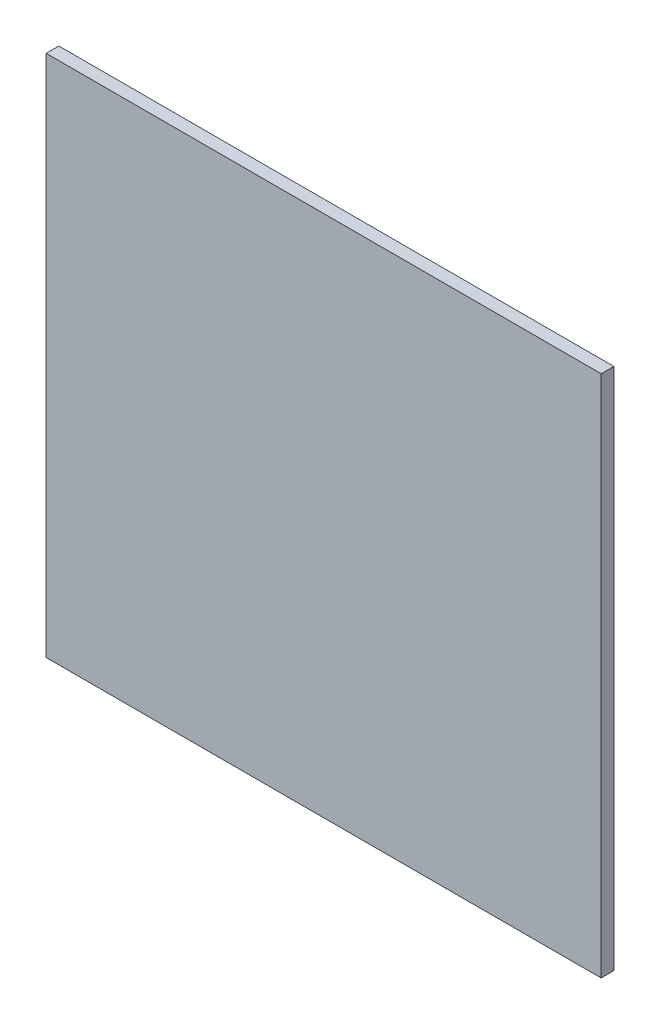
ISO-10303-21;
HEADER;
FILE_DESCRIPTION(('STEP AP214'),'2;1');
FILE_NAME('part.step','',(''),(''),'','','');
FILE_SCHEMA(('AUTOMOTIVE_DESIGN { 1 0 10303 214 1 1 1 1 }'));
ENDSEC;
DATA;
#1=APPLICATION_CONTEXT('core data for automotive mechanical design processes');
#2=APPLICATION_PROTOCOL_DEFINITION('international standard','automotive_design',2000,#1);
#3=PRODUCT_CONTEXT('',#1,'mechanical');
#4=PRODUCT('Part','Part','',(#3));
#5=PRODUCT_RELATED_PRODUCT_CATEGORY('part','',(#4));
#6=PRODUCT_DEFINITION_FORMATION('','',#4);
#7=PRODUCT_DEFINITION_CONTEXT('part definition',#1,'design');
#8=PRODUCT_DEFINITION('design','',#6,#7);
#9=PRODUCT_DEFINITION_SHAPE('','',#8);
#10=(LENGTH_UNIT() NAMED_UNIT(*) SI_UNIT(.MILLI.,.METRE.));
#11=(NAMED_UNIT(*) PLANE_ANGLE_UNIT() SI_UNIT($,.RADIAN.));
#12=(NAMED_UNIT(*) SI_UNIT($,.STERADIAN.) SOLID_ANGLE_UNIT());
#13=UNCERTAINTY_MEASURE_WITH_UNIT(LENGTH_MEASURE(1.E-05),#10,'distance_accuracy_value','');
#14=(GEOMETRIC_REPRESENTATION_CONTEXT(3) GLOBAL_UNCERTAINTY_ASSIGNED_CONTEXT((#13)) GLOBAL_UNIT_ASSIGNED_CONTEXT((#10,
#11,#12)) REPRESENTATION_CONTEXT('',''));
#15=CARTESIAN_POINT('',(0.,0.,0.));
#16=DIRECTION('',(0.,0.,1.));
#17=DIRECTION('',(1.,0.,0.));
#18=AXIS2_PLACEMENT_3D('',#15,#16,#17);
#19=CARTESIAN_POINT('',(-34.0676694116269,62.1316207113658,1.6));
#20=DIRECTION('',(1.,0.,0.));
#21=DIRECTION('',(0.,1.,0.));
#22=AXIS2_PLACEMENT_3D('',#19,#20,#21);
#23=PLANE('',#22);
#24=DIRECTION('',(0.,-1.,0.));
#25=VECTOR('',#24,1.);
#26=CARTESIAN_POINT('',(-34.0676694116269,62.1316207113658,0.));
#27=LINE('',#26,#25);
#28=CARTESIAN_POINT('',(-34.0676694116269,62.1316207113658,0.));
#29=VERTEX_POINT('',#28);
#30=CARTESIAN_POINT('',(-34.0676694116269,-3.8683792886342,0.));
#31=VERTEX_POINT('',#30);
#32=EDGE_CURVE('E96',#29,#31,#27,.T.);
#33=ORIENTED_EDGE('',*,*,#32,.T.);
#34=DIRECTION('',(0.,0.,-1.));
#35=VECTOR('',#34,1.);
#36=CARTESIAN_POINT('',(-34.0676694116269,-3.8683792886342,1.6));
#37=LINE('',#36,#35);
#38=CARTESIAN_POINT('',(-34.0676694116269,-3.8683792886342,1.6));
#39=VERTEX_POINT('',#38);
#40=EDGE_CURVE('E11',#39,#31,#37,.T.);
#41=ORIENTED_EDGE('',*,*,#40,.F.);
#42=DIRECTION('',(0.,-1.,0.));
#43=VECTOR('',#42,1.);
#44=CARTESIAN_POINT('',(-34.0676694116269,62.1316207113658,1.6));
#45=LINE('',#44,#43);
#46=CARTESIAN_POINT('',(-34.0676694116269,62.1316207113658,1.6));
#47=VERTEX_POINT('',#46);
#48=EDGE_CURVE('E84',#47,#39,#45,.T.);
#49=ORIENTED_EDGE('',*,*,#48,.F.);
#50=DIRECTION('',(0.,0.,-1.));
#51=VECTOR('',#50,1.);
#52=CARTESIAN_POINT('',(-34.0676694116269,62.1316207113658,1.6));
#53=LINE('',#52,#51);
#54=EDGE_CURVE('E92',#47,#29,#53,.T.);
#55=ORIENTED_EDGE('',*,*,#54,.T.);
#56=EDGE_LOOP('',(#33,#41,#49,#55));
#57=FACE_BOUND('',#56,.T.);
#58=ADVANCED_FACE('F33',(#57),#23,.F.);
#59=CARTESIAN_POINT('',(-34.0676694116269,-3.8683792886342,1.6));
#60=DIRECTION('',(0.,1.,0.));
#61=DIRECTION('',(0.,0.,1.));
#62=AXIS2_PLACEMENT_3D('',#59,#60,#61);
#63=PLANE('',#62);
#64=DIRECTION('',(1.,0.,0.));
#65=VECTOR('',#64,1.);
#66=CARTESIAN_POINT('',(-34.0676694116269,-3.8683792886342,0.));
#67=LINE('',#66,#65);
#68=CARTESIAN_POINT('',(35.9323305883732,-3.8683792886342,0.));
#69=VERTEX_POINT('',#68);
#70=EDGE_CURVE('E88',#31,#69,#67,.T.);
#71=ORIENTED_EDGE('',*,*,#70,.T.);
#72=DIRECTION('',(0.,0.,-1.));
#73=VECTOR('',#72,1.);
#74=CARTESIAN_POINT('',(35.9323305883732,-3.8683792886342,1.6));
#75=LINE('',#74,#73);
#76=CARTESIAN_POINT('',(35.9323305883732,-3.8683792886342,1.6));
#77=VERTEX_POINT('',#76);
#78=EDGE_CURVE('E41',#77,#69,#75,.T.);
#79=ORIENTED_EDGE('',*,*,#78,.F.);
#80=DIRECTION('',(1.,0.,0.));
#81=VECTOR('',#80,1.);
#82=CARTESIAN_POINT('',(-34.0676694116269,-3.8683792886342,1.6));
#83=LINE('',#82,#81);
#84=EDGE_CURVE('E79',#39,#77,#83,.T.);
#85=ORIENTED_EDGE('',*,*,#84,.F.);
#86=ORIENTED_EDGE('',*,*,#40,.T.);
#87=EDGE_LOOP('',(#71,#79,#85,#86));
#88=FACE_BOUND('',#87,.T.);
#89=ADVANCED_FACE('F87',(#88),#63,.F.);
#90=CARTESIAN_POINT('',(35.9323305883731,62.1316207113658,1.6));
#91=DIRECTION('',(-1.,0.,0.));
#92=DIRECTION('',(0.,-1.,0.));
#93=AXIS2_PLACEMENT_3D('',#90,#91,#92);
#94=PLANE('',#93);
#95=DIRECTION('',(0.,1.,0.));
#96=VECTOR('',#95,1.);
#97=CARTESIAN_POINT('',(35.9323305883731,62.1316207113658,0.));
#98=LINE('',#97,#96);
#99=CARTESIAN_POINT('',(35.9323305883731,62.1316207113658,0.));
#100=VERTEX_POINT('',#99);
#101=EDGE_CURVE('E66',#69,#100,#98,.T.);
#102=ORIENTED_EDGE('',*,*,#101,.T.);
#103=DIRECTION('',(0.,0.,-1.));
#104=VECTOR('',#103,1.);
#105=CARTESIAN_POINT('',(35.9323305883731,62.1316207113658,1.6));
#106=LINE('',#105,#104);
#107=CARTESIAN_POINT('',(35.9323305883731,62.1316207113658,1.6));
#108=VERTEX_POINT('',#107);
#109=EDGE_CURVE('E89',#108,#100,#106,.T.);
#110=ORIENTED_EDGE('',*,*,#109,.F.);
#111=DIRECTION('',(0.,1.,0.));
#112=VECTOR('',#111,1.);
#113=CARTESIAN_POINT('',(35.9323305883731,62.1316207113658,1.6));
#114=LINE('',#113,#112);
#115=EDGE_CURVE('E82',#77,#108,#114,.T.);
#116=ORIENTED_EDGE('',*,*,#115,.F.);
#117=ORIENTED_EDGE('',*,*,#78,.T.);
#118=EDGE_LOOP('',(#102,#110,#116,#117));
#119=FACE_BOUND('',#118,.T.);
#120=ADVANCED_FACE('F90',(#119),#94,.F.);
#121=CARTESIAN_POINT('',(-34.0676694116269,62.1316207113658,1.6));
#122=DIRECTION('',(0.,-1.,0.));
#123=DIRECTION('',(0.,0.,-1.));
#124=AXIS2_PLACEMENT_3D('',#121,#122,#123);
#125=PLANE('',#124);
#126=DIRECTION('',(-1.,0.,0.));
#127=VECTOR('',#126,1.);
#128=CARTESIAN_POINT('',(-34.0676694116269,62.1316207113658,0.));
#129=LINE('',#128,#127);
#130=EDGE_CURVE('E72',#100,#29,#129,.T.);
#131=ORIENTED_EDGE('',*,*,#130,.T.);
#132=ORIENTED_EDGE('',*,*,#54,.F.);
#133=DIRECTION('',(-1.,0.,0.));
#134=VECTOR('',#133,1.);
#135=CARTESIAN_POINT('',(-34.0676694116269,62.1316207113658,1.6));
#136=LINE('',#135,#134);
#137=EDGE_CURVE('E49',#108,#47,#136,.T.);
#138=ORIENTED_EDGE('',*,*,#137,.F.);
#139=ORIENTED_EDGE('',*,*,#109,.T.);
#140=EDGE_LOOP('',(#131,#132,#138,#139));
#141=FACE_BOUND('',#140,.T.);
#142=ADVANCED_FACE('F103',(#141),#125,.F.);
#143=CARTESIAN_POINT('',(0.,0.,1.6));
#144=DIRECTION('',(0.,0.,1.));
#145=DIRECTION('',(1.,0.,0.));
#146=AXIS2_PLACEMENT_3D('',#143,#144,#145);
#147=PLANE('',#146);
#148=ORIENTED_EDGE('',*,*,#48,.T.);
#149=ORIENTED_EDGE('',*,*,#84,.T.);
#150=ORIENTED_EDGE('',*,*,#115,.T.);
#151=ORIENTED_EDGE('',*,*,#137,.T.);
#152=EDGE_LOOP('',(#148,#149,#150,#151));
#153=FACE_BOUND('',#152,.T.);
#154=ADVANCED_FACE('F80',(#153),#147,.T.);
#155=CARTESIAN_POINT('',(0.,0.,0.));
#156=DIRECTION('',(0.,0.,1.));
#157=DIRECTION('',(1.,0.,0.));
#158=AXIS2_PLACEMENT_3D('',#155,#156,#157);
#159=PLANE('',#158);
#160=ORIENTED_EDGE('',*,*,#32,.F.);
#161=ORIENTED_EDGE('',*,*,#130,.F.);
#162=ORIENTED_EDGE('',*,*,#101,.F.);
#163=ORIENTED_EDGE('',*,*,#70,.F.);
#164=EDGE_LOOP('',(#160,#161,#162,#163));
#165=FACE_BOUND('',#164,.T.);
#166=ADVANCED_FACE('F106',(#165),#159,.F.);
#167=CLOSED_SHELL('',(#58,#89,#120,#142,#154,#166));
#168=MANIFOLD_SOLID_BREP('B2',#167);
#169=ADVANCED_BREP_SHAPE_REPRESENTATION('',(#18,#168),#14);
#170=SHAPE_DEFINITION_REPRESENTATION(#9,#169);
ENDSEC;
END-ISO-10303-21;
